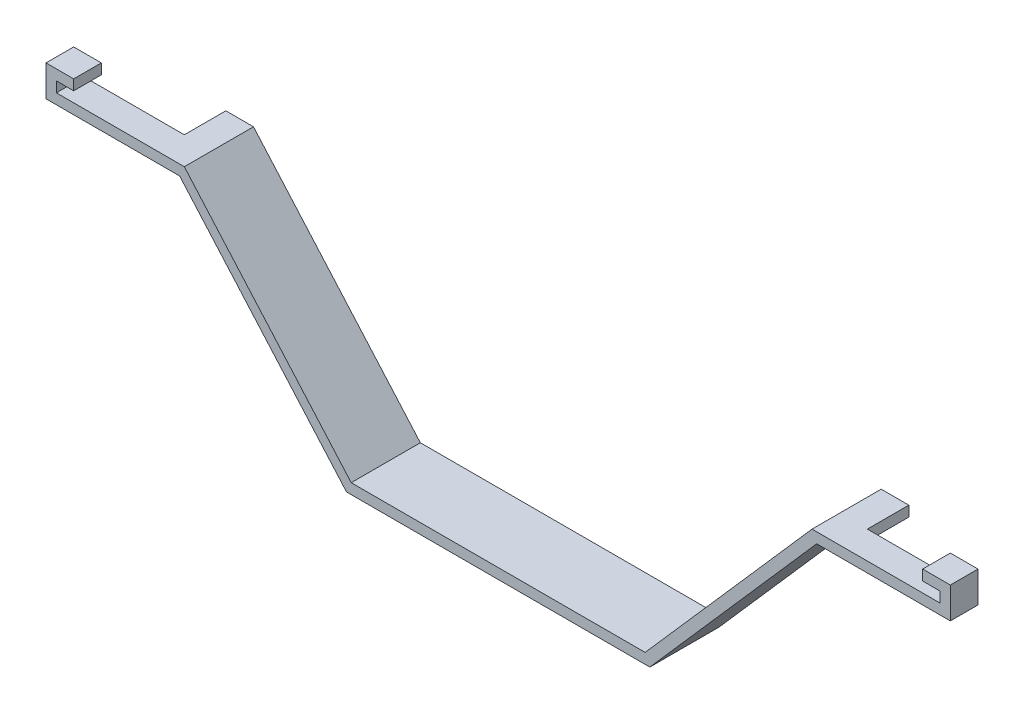
ISO-10303-21;
HEADER;
FILE_DESCRIPTION(('STEP AP214'),'2;1');
FILE_NAME('part.step','',(''),(''),'','','');
FILE_SCHEMA(('AUTOMOTIVE_DESIGN { 1 0 10303 214 1 1 1 1 }'));
ENDSEC;
DATA;
#1=APPLICATION_CONTEXT('core data for automotive mechanical design processes');
#2=APPLICATION_PROTOCOL_DEFINITION('international standard','automotive_design',2000,#1);
#3=PRODUCT_CONTEXT('',#1,'mechanical');
#4=PRODUCT('Part','Part','',(#3));
#5=PRODUCT_RELATED_PRODUCT_CATEGORY('part','',(#4));
#6=PRODUCT_DEFINITION_FORMATION('','',#4);
#7=PRODUCT_DEFINITION_CONTEXT('part definition',#1,'design');
#8=PRODUCT_DEFINITION('design','',#6,#7);
#9=PRODUCT_DEFINITION_SHAPE('','',#8);
#10=(LENGTH_UNIT() NAMED_UNIT(*) SI_UNIT(.MILLI.,.METRE.));
#11=(NAMED_UNIT(*) PLANE_ANGLE_UNIT() SI_UNIT($,.RADIAN.));
#12=(NAMED_UNIT(*) SI_UNIT($,.STERADIAN.) SOLID_ANGLE_UNIT());
#13=UNCERTAINTY_MEASURE_WITH_UNIT(LENGTH_MEASURE(1.E-05),#10,'distance_accuracy_value','');
#14=(GEOMETRIC_REPRESENTATION_CONTEXT(3) GLOBAL_UNCERTAINTY_ASSIGNED_CONTEXT((#13)) GLOBAL_UNIT_ASSIGNED_CONTEXT((#10,
#11,#12)) REPRESENTATION_CONTEXT('',''));
#15=CARTESIAN_POINT('',(0.,0.,0.));
#16=DIRECTION('',(0.,0.,1.));
#17=DIRECTION('',(1.,0.,0.));
#18=AXIS2_PLACEMENT_3D('',#15,#16,#17);
#19=CARTESIAN_POINT('',(-136.925616004308,29.5889707372712,20.));
#20=DIRECTION('',(-0.751729394315314,-0.65947169592207,0.));
#21=DIRECTION('',(0.65947169592207,-0.751729394315314,0.));
#22=AXIS2_PLACEMENT_3D('',#19,#20,#21);
#23=PLANE('',#22);
#24=DIRECTION('',(-0.65947169592207,0.751729394315314,0.));
#25=VECTOR('',#24,1.);
#26=CARTESIAN_POINT('',(-136.925616004308,29.5889707372712,0.));
#27=LINE('',#26,#25);
#28=CARTESIAN_POINT('',(-88.6756160043085,-25.4110292627288,0.));
#29=VERTEX_POINT('',#28);
#30=CARTESIAN_POINT('',(-136.925616004308,29.5889707372712,0.));
#31=VERTEX_POINT('',#30);
#32=EDGE_CURVE('E288',#29,#31,#27,.T.);
#33=ORIENTED_EDGE('',*,*,#32,.T.);
#34=DIRECTION('',(0.,0.,-1.));
#35=VECTOR('',#34,1.);
#36=CARTESIAN_POINT('',(-136.925616004308,29.5889707372712,20.));
#37=LINE('',#36,#35);
#38=CARTESIAN_POINT('',(-136.925616004308,29.5889707372712,20.));
#39=VERTEX_POINT('',#38);
#40=EDGE_CURVE('E235',#39,#31,#37,.T.);
#41=ORIENTED_EDGE('',*,*,#40,.F.);
#42=DIRECTION('',(-0.65947169592207,0.751729394315314,0.));
#43=VECTOR('',#42,1.);
#44=CARTESIAN_POINT('',(-136.925616004308,29.5889707372712,20.));
#45=LINE('',#44,#43);
#46=CARTESIAN_POINT('',(-88.6756160043085,-25.4110292627288,20.));
#47=VERTEX_POINT('',#46);
#48=EDGE_CURVE('E289',#47,#39,#45,.T.);
#49=ORIENTED_EDGE('',*,*,#48,.F.);
#50=DIRECTION('',(0.,0.,-1.));
#51=VECTOR('',#50,1.);
#52=CARTESIAN_POINT('',(-88.6756160043085,-25.4110292627288,20.));
#53=LINE('',#52,#51);
#54=EDGE_CURVE('E330',#47,#29,#53,.T.);
#55=ORIENTED_EDGE('',*,*,#54,.T.);
#56=EDGE_LOOP('',(#33,#41,#49,#55));
#57=FACE_BOUND('',#56,.T.);
#58=ADVANCED_FACE('F33',(#57),#23,.F.);
#59=CARTESIAN_POINT('',(-173.925616004308,29.5889707372712,20.));
#60=DIRECTION('',(0.,-1.,0.));
#61=DIRECTION('',(0.,0.,-1.));
#62=AXIS2_PLACEMENT_3D('',#59,#60,#61);
#63=PLANE('',#62);
#64=DIRECTION('',(-1.,0.,0.));
#65=VECTOR('',#64,1.);
#66=CARTESIAN_POINT('',(-173.925616004308,29.5889707372712,0.));
#67=LINE('',#66,#65);
#68=CARTESIAN_POINT('',(-144.925616004308,29.5889707372712,0.));
#69=VERTEX_POINT('',#68);
#70=EDGE_CURVE('E333',#31,#69,#67,.T.);
#71=ORIENTED_EDGE('',*,*,#70,.T.);
#72=DIRECTION('',(0.,0.,1.));
#73=VECTOR('',#72,1.);
#74=CARTESIAN_POINT('',(-144.925616004308,29.5889707372712,20.));
#75=LINE('',#74,#73);
#76=CARTESIAN_POINT('',(-144.925616004308,29.5889707372712,12.));
#77=VERTEX_POINT('',#76);
#78=EDGE_CURVE('E47',#69,#77,#75,.T.);
#79=ORIENTED_EDGE('',*,*,#78,.T.);
#80=DIRECTION('',(-1.,0.,0.));
#81=VECTOR('',#80,1.);
#82=CARTESIAN_POINT('',(-173.925616004308,29.5889707372712,12.));
#83=LINE('',#82,#81);
#84=CARTESIAN_POINT('',(-173.925616004308,29.5889707372712,12.));
#85=VERTEX_POINT('',#84);
#86=EDGE_CURVE('E285',#77,#85,#83,.T.);
#87=ORIENTED_EDGE('',*,*,#86,.T.);
#88=DIRECTION('',(0.,0.,-1.));
#89=VECTOR('',#88,1.);
#90=CARTESIAN_POINT('',(-173.925616004308,29.5889707372712,20.));
#91=LINE('',#90,#89);
#92=CARTESIAN_POINT('',(-173.925616004308,29.5889707372712,20.));
#93=VERTEX_POINT('',#92);
#94=EDGE_CURVE('E232',#93,#85,#91,.T.);
#95=ORIENTED_EDGE('',*,*,#94,.F.);
#96=DIRECTION('',(-1.,0.,0.));
#97=VECTOR('',#96,1.);
#98=CARTESIAN_POINT('',(-173.925616004308,29.5889707372712,20.));
#99=LINE('',#98,#97);
#100=EDGE_CURVE('E292',#39,#93,#99,.T.);
#101=ORIENTED_EDGE('',*,*,#100,.F.);
#102=ORIENTED_EDGE('',*,*,#40,.T.);
#103=EDGE_LOOP('',(#71,#79,#87,#95,#101,#102));
#104=FACE_BOUND('',#103,.T.);
#105=ADVANCED_FACE('F421',(#104),#63,.F.);
#106=CARTESIAN_POINT('',(-173.925616004308,32.5889707372712,20.));
#107=DIRECTION('',(-1.,0.,0.));
#108=DIRECTION('',(0.,0.,1.));
#109=AXIS2_PLACEMENT_3D('',#106,#107,#108);
#110=PLANE('',#109);
#111=ORIENTED_EDGE('',*,*,#94,.T.);
#112=DIRECTION('',(0.,1.,0.));
#113=VECTOR('',#112,1.);
#114=CARTESIAN_POINT('',(-173.925616004308,32.5889707372712,12.));
#115=LINE('',#114,#113);
#116=CARTESIAN_POINT('',(-173.925616004308,32.5889707372712,12.));
#117=VERTEX_POINT('',#116);
#118=EDGE_CURVE('E282',#85,#117,#115,.T.);
#119=ORIENTED_EDGE('',*,*,#118,.T.);
#120=DIRECTION('',(0.,0.,-1.));
#121=VECTOR('',#120,1.);
#122=CARTESIAN_POINT('',(-173.925616004308,32.5889707372712,20.));
#123=LINE('',#122,#121);
#124=CARTESIAN_POINT('',(-173.925616004308,32.5889707372712,20.));
#125=VERTEX_POINT('',#124);
#126=EDGE_CURVE('E229',#125,#117,#123,.T.);
#127=ORIENTED_EDGE('',*,*,#126,.F.);
#128=DIRECTION('',(0.,1.,0.));
#129=VECTOR('',#128,1.);
#130=CARTESIAN_POINT('',(-173.925616004308,32.5889707372712,20.));
#131=LINE('',#130,#129);
#132=EDGE_CURVE('E295',#93,#125,#131,.T.);
#133=ORIENTED_EDGE('',*,*,#132,.F.);
#134=EDGE_LOOP('',(#111,#119,#127,#133));
#135=FACE_BOUND('',#134,.T.);
#136=ADVANCED_FACE('F470',(#135),#110,.F.);
#137=CARTESIAN_POINT('',(-168.925616004308,32.5889707372712,20.));
#138=DIRECTION('',(0.,1.,0.));
#139=DIRECTION('',(0.,0.,1.));
#140=AXIS2_PLACEMENT_3D('',#137,#138,#139);
#141=PLANE('',#140);
#142=ORIENTED_EDGE('',*,*,#126,.T.);
#143=DIRECTION('',(1.,0.,0.));
#144=VECTOR('',#143,1.);
#145=CARTESIAN_POINT('',(-168.925616004308,32.5889707372712,12.));
#146=LINE('',#145,#144);
#147=CARTESIAN_POINT('',(-168.925616004308,32.5889707372712,12.));
#148=VERTEX_POINT('',#147);
#149=EDGE_CURVE('E279',#117,#148,#146,.T.);
#150=ORIENTED_EDGE('',*,*,#149,.T.);
#151=DIRECTION('',(0.,0.,-1.));
#152=VECTOR('',#151,1.);
#153=CARTESIAN_POINT('',(-168.925616004308,32.5889707372712,20.));
#154=LINE('',#153,#152);
#155=CARTESIAN_POINT('',(-168.925616004308,32.5889707372712,20.));
#156=VERTEX_POINT('',#155);
#157=EDGE_CURVE('E221',#156,#148,#154,.T.);
#158=ORIENTED_EDGE('',*,*,#157,.F.);
#159=DIRECTION('',(1.,0.,0.));
#160=VECTOR('',#159,1.);
#161=CARTESIAN_POINT('',(-168.925616004308,32.5889707372712,20.));
#162=LINE('',#161,#160);
#163=EDGE_CURVE('E297',#125,#156,#162,.T.);
#164=ORIENTED_EDGE('',*,*,#163,.F.);
#165=EDGE_LOOP('',(#142,#150,#158,#164));
#166=FACE_BOUND('',#165,.T.);
#167=ADVANCED_FACE('F474',(#166),#141,.F.);
#168=CARTESIAN_POINT('',(-168.925616004308,35.5889707372712,20.));
#169=DIRECTION('',(-1.,0.,0.));
#170=DIRECTION('',(0.,0.,1.));
#171=AXIS2_PLACEMENT_3D('',#168,#169,#170);
#172=PLANE('',#171);
#173=ORIENTED_EDGE('',*,*,#157,.T.);
#174=DIRECTION('',(0.,1.,0.));
#175=VECTOR('',#174,1.);
#176=CARTESIAN_POINT('',(-168.925616004308,35.5889707372712,12.));
#177=LINE('',#176,#175);
#178=CARTESIAN_POINT('',(-168.925616004308,35.5889707372712,12.));
#179=VERTEX_POINT('',#178);
#180=EDGE_CURVE('E277',#148,#179,#177,.T.);
#181=ORIENTED_EDGE('',*,*,#180,.T.);
#182=DIRECTION('',(0.,0.,-1.));
#183=VECTOR('',#182,1.);
#184=CARTESIAN_POINT('',(-168.925616004308,35.5889707372712,20.));
#185=LINE('',#184,#183);
#186=CARTESIAN_POINT('',(-168.925616004308,35.5889707372712,20.));
#187=VERTEX_POINT('',#186);
#188=EDGE_CURVE('E214',#187,#179,#185,.T.);
#189=ORIENTED_EDGE('',*,*,#188,.F.);
#190=DIRECTION('',(0.,1.,0.));
#191=VECTOR('',#190,1.);
#192=CARTESIAN_POINT('',(-168.925616004308,35.5889707372712,20.));
#193=LINE('',#192,#191);
#194=EDGE_CURVE('E299',#156,#187,#193,.T.);
#195=ORIENTED_EDGE('',*,*,#194,.F.);
#196=EDGE_LOOP('',(#173,#181,#189,#195));
#197=FACE_BOUND('',#196,.T.);
#198=ADVANCED_FACE('F480',(#197),#172,.F.);
#199=CARTESIAN_POINT('',(-176.925616004308,35.5889707372712,20.));
#200=DIRECTION('',(0.,-1.,0.));
#201=DIRECTION('',(0.,0.,-1.));
#202=AXIS2_PLACEMENT_3D('',#199,#200,#201);
#203=PLANE('',#202);
#204=ORIENTED_EDGE('',*,*,#188,.T.);
#205=DIRECTION('',(1.,0.,0.));
#206=VECTOR('',#205,1.);
#207=CARTESIAN_POINT('',(-176.925616004308,35.5889707372712,12.));
#208=LINE('',#207,#206);
#209=CARTESIAN_POINT('',(-176.925616004308,35.5889707372712,12.));
#210=VERTEX_POINT('',#209);
#211=EDGE_CURVE('E198',#210,#179,#208,.T.);
#212=ORIENTED_EDGE('',*,*,#211,.F.);
#213=DIRECTION('',(0.,0.,-1.));
#214=VECTOR('',#213,1.);
#215=CARTESIAN_POINT('',(-176.925616004308,35.5889707372712,20.));
#216=LINE('',#215,#214);
#217=CARTESIAN_POINT('',(-176.925616004308,35.5889707372712,20.));
#218=VERTEX_POINT('',#217);
#219=EDGE_CURVE('E211',#218,#210,#216,.T.);
#220=ORIENTED_EDGE('',*,*,#219,.F.);
#221=DIRECTION('',(-1.,0.,0.));
#222=VECTOR('',#221,1.);
#223=CARTESIAN_POINT('',(-176.925616004308,35.5889707372712,20.));
#224=LINE('',#223,#222);
#225=EDGE_CURVE('E301',#187,#218,#224,.T.);
#226=ORIENTED_EDGE('',*,*,#225,.F.);
#227=EDGE_LOOP('',(#204,#212,#220,#226));
#228=FACE_BOUND('',#227,.T.);
#229=ADVANCED_FACE('F209',(#228),#203,.F.);
#230=CARTESIAN_POINT('',(-176.925616004308,26.5889707372712,20.));
#231=DIRECTION('',(1.,0.,0.));
#232=DIRECTION('',(0.,0.,-1.));
#233=AXIS2_PLACEMENT_3D('',#230,#231,#232);
#234=PLANE('',#233);
#235=ORIENTED_EDGE('',*,*,#219,.T.);
#236=DIRECTION('',(0.,1.,0.));
#237=VECTOR('',#236,1.);
#238=CARTESIAN_POINT('',(-176.925616004308,-28.4110292627288,12.));
#239=LINE('',#238,#237);
#240=CARTESIAN_POINT('',(-176.925616004308,26.5889707372712,12.));
#241=VERTEX_POINT('',#240);
#242=EDGE_CURVE('E194',#241,#210,#239,.T.);
#243=ORIENTED_EDGE('',*,*,#242,.F.);
#244=DIRECTION('',(0.,0.,-1.));
#245=VECTOR('',#244,1.);
#246=CARTESIAN_POINT('',(-176.925616004308,26.5889707372712,20.));
#247=LINE('',#246,#245);
#248=CARTESIAN_POINT('',(-176.925616004308,26.5889707372712,20.));
#249=VERTEX_POINT('',#248);
#250=EDGE_CURVE('E219',#249,#241,#247,.T.);
#251=ORIENTED_EDGE('',*,*,#250,.F.);
#252=DIRECTION('',(0.,-1.,0.));
#253=VECTOR('',#252,1.);
#254=CARTESIAN_POINT('',(-176.925616004308,26.5889707372712,20.));
#255=LINE('',#254,#253);
#256=EDGE_CURVE('E218',#218,#249,#255,.T.);
#257=ORIENTED_EDGE('',*,*,#256,.F.);
#258=EDGE_LOOP('',(#235,#243,#251,#257));
#259=FACE_BOUND('',#258,.T.);
#260=ADVANCED_FACE('F217',(#259),#234,.F.);
#261=CARTESIAN_POINT('',(-176.925616004308,26.5889707372712,20.));
#262=DIRECTION('',(0.,1.,0.));
#263=DIRECTION('',(0.,0.,1.));
#264=AXIS2_PLACEMENT_3D('',#261,#262,#263);
#265=PLANE('',#264);
#266=DIRECTION('',(1.,0.,0.));
#267=VECTOR('',#266,1.);
#268=CARTESIAN_POINT('',(-176.925616004308,26.5889707372712,12.));
#269=LINE('',#268,#267);
#270=CARTESIAN_POINT('',(-144.925616004308,26.5889707372712,12.));
#271=VERTEX_POINT('',#270);
#272=EDGE_CURVE('E11',#241,#271,#269,.T.);
#273=ORIENTED_EDGE('',*,*,#272,.T.);
#274=DIRECTION('',(0.,0.,-1.));
#275=VECTOR('',#274,1.);
#276=CARTESIAN_POINT('',(-144.925616004308,26.5889707372712,20.));
#277=LINE('',#276,#275);
#278=CARTESIAN_POINT('',(-144.925616004308,26.5889707372712,0.));
#279=VERTEX_POINT('',#278);
#280=EDGE_CURVE('E268',#271,#279,#277,.T.);
#281=ORIENTED_EDGE('',*,*,#280,.T.);
#282=DIRECTION('',(1.,0.,0.));
#283=VECTOR('',#282,1.);
#284=CARTESIAN_POINT('',(-176.925616004308,26.5889707372712,0.));
#285=LINE('',#284,#283);
#286=CARTESIAN_POINT('',(-138.284595605158,26.5889707372712,0.));
#287=VERTEX_POINT('',#286);
#288=EDGE_CURVE('E336',#279,#287,#285,.T.);
#289=ORIENTED_EDGE('',*,*,#288,.T.);
#290=DIRECTION('',(0.,0.,-1.));
#291=VECTOR('',#290,1.);
#292=CARTESIAN_POINT('',(-138.284595605158,26.5889707372712,20.));
#293=LINE('',#292,#291);
#294=CARTESIAN_POINT('',(-138.284595605158,26.5889707372712,20.));
#295=VERTEX_POINT('',#294);
#296=EDGE_CURVE('E223',#295,#287,#293,.T.);
#297=ORIENTED_EDGE('',*,*,#296,.F.);
#298=DIRECTION('',(1.,0.,0.));
#299=VECTOR('',#298,1.);
#300=CARTESIAN_POINT('',(-176.925616004308,26.5889707372712,20.));
#301=LINE('',#300,#299);
#302=EDGE_CURVE('E304',#249,#295,#301,.T.);
#303=ORIENTED_EDGE('',*,*,#302,.F.);
#304=ORIENTED_EDGE('',*,*,#250,.T.);
#305=EDGE_LOOP('',(#273,#281,#289,#297,#303,#304));
#306=FACE_BOUND('',#305,.T.);
#307=ADVANCED_FACE('F409',(#306),#265,.F.);
#308=CARTESIAN_POINT('',(-138.284595605158,26.5889707372712,20.));
#309=DIRECTION('',(0.751729394315314,0.65947169592207,0.));
#310=DIRECTION('',(-0.65947169592207,0.751729394315314,0.));
#311=AXIS2_PLACEMENT_3D('',#308,#309,#310);
#312=PLANE('',#311);
#313=DIRECTION('',(0.65947169592207,-0.751729394315314,0.));
#314=VECTOR('',#313,1.);
#315=CARTESIAN_POINT('',(-138.284595605158,26.5889707372712,0.));
#316=LINE('',#315,#314);
#317=CARTESIAN_POINT('',(-90.0345956051584,-28.4110292627288,0.));
#318=VERTEX_POINT('',#317);
#319=EDGE_CURVE('E338',#287,#318,#316,.T.);
#320=ORIENTED_EDGE('',*,*,#319,.T.);
#321=DIRECTION('',(0.,0.,-1.));
#322=VECTOR('',#321,1.);
#323=CARTESIAN_POINT('',(-90.0345956051584,-28.4110292627288,20.));
#324=LINE('',#323,#322);
#325=CARTESIAN_POINT('',(-90.0345956051584,-28.4110292627288,20.));
#326=VERTEX_POINT('',#325);
#327=EDGE_CURVE('E380',#326,#318,#324,.T.);
#328=ORIENTED_EDGE('',*,*,#327,.F.);
#329=DIRECTION('',(0.65947169592207,-0.751729394315314,0.));
#330=VECTOR('',#329,1.);
#331=CARTESIAN_POINT('',(-138.284595605158,26.5889707372712,20.));
#332=LINE('',#331,#330);
#333=EDGE_CURVE('E306',#295,#326,#332,.T.);
#334=ORIENTED_EDGE('',*,*,#333,.F.);
#335=ORIENTED_EDGE('',*,*,#296,.T.);
#336=EDGE_LOOP('',(#320,#328,#334,#335));
#337=FACE_BOUND('',#336,.T.);
#338=ADVANCED_FACE('F387',(#337),#312,.F.);
#339=CARTESIAN_POINT('',(-90.0345956051584,-28.4110292627288,20.));
#340=DIRECTION('',(0.,1.,0.));
#341=DIRECTION('',(0.,0.,1.));
#342=AXIS2_PLACEMENT_3D('',#339,#340,#341);
#343=PLANE('',#342);
#344=DIRECTION('',(1.,0.,0.));
#345=VECTOR('',#344,1.);
#346=CARTESIAN_POINT('',(-90.0345956051584,-28.4110292627288,0.));
#347=LINE('',#346,#345);
#348=CARTESIAN_POINT('',(-2.31663640345854,-28.4110292627288,0.));
#349=VERTEX_POINT('',#348);
#350=EDGE_CURVE('E340',#318,#349,#347,.T.);
#351=ORIENTED_EDGE('',*,*,#350,.T.);
#352=DIRECTION('',(0.,0.,-1.));
#353=VECTOR('',#352,1.);
#354=CARTESIAN_POINT('',(-2.31663640345854,-28.4110292627288,20.));
#355=LINE('',#354,#353);
#356=CARTESIAN_POINT('',(-2.31663640345854,-28.4110292627288,20.));
#357=VERTEX_POINT('',#356);
#358=EDGE_CURVE('E377',#357,#349,#355,.T.);
#359=ORIENTED_EDGE('',*,*,#358,.F.);
#360=DIRECTION('',(1.,0.,0.));
#361=VECTOR('',#360,1.);
#362=CARTESIAN_POINT('',(-90.0345956051584,-28.4110292627288,20.));
#363=LINE('',#362,#361);
#364=EDGE_CURVE('E308',#326,#357,#363,.T.);
#365=ORIENTED_EDGE('',*,*,#364,.F.);
#366=ORIENTED_EDGE('',*,*,#327,.T.);
#367=EDGE_LOOP('',(#351,#359,#365,#366));
#368=FACE_BOUND('',#367,.T.);
#369=ADVANCED_FACE('F399',(#368),#343,.F.);
#370=CARTESIAN_POINT('',(45.9333635965414,26.5889707372712,20.));
#371=DIRECTION('',(-0.751729394315314,0.65947169592207,0.));
#372=DIRECTION('',(-0.65947169592207,-0.751729394315314,0.));
#373=AXIS2_PLACEMENT_3D('',#370,#371,#372);
#374=PLANE('',#373);
#375=DIRECTION('',(0.65947169592207,0.751729394315314,0.));
#376=VECTOR('',#375,1.);
#377=CARTESIAN_POINT('',(45.9333635965414,26.5889707372712,0.));
#378=LINE('',#377,#376);
#379=CARTESIAN_POINT('',(45.9333635965414,26.5889707372712,0.));
#380=VERTEX_POINT('',#379);
#381=EDGE_CURVE('E342',#349,#380,#378,.T.);
#382=ORIENTED_EDGE('',*,*,#381,.T.);
#383=DIRECTION('',(0.,0.,-1.));
#384=VECTOR('',#383,1.);
#385=CARTESIAN_POINT('',(45.9333635965414,26.5889707372712,20.));
#386=LINE('',#385,#384);
#387=CARTESIAN_POINT('',(45.9333635965414,26.5889707372712,20.));
#388=VERTEX_POINT('',#387);
#389=EDGE_CURVE('E374',#388,#380,#386,.T.);
#390=ORIENTED_EDGE('',*,*,#389,.F.);
#391=DIRECTION('',(0.65947169592207,0.751729394315314,0.));
#392=VECTOR('',#391,1.);
#393=CARTESIAN_POINT('',(45.9333635965414,26.5889707372712,20.));
#394=LINE('',#393,#392);
#395=EDGE_CURVE('E310',#357,#388,#394,.T.);
#396=ORIENTED_EDGE('',*,*,#395,.F.);
#397=ORIENTED_EDGE('',*,*,#358,.T.);
#398=EDGE_LOOP('',(#382,#390,#396,#397));
#399=FACE_BOUND('',#398,.T.);
#400=ADVANCED_FACE('F403',(#399),#374,.F.);
#401=CARTESIAN_POINT('',(84.5743839956915,26.5889707372712,20.));
#402=DIRECTION('',(0.,1.,0.));
#403=DIRECTION('',(-1.,0.,0.));
#404=AXIS2_PLACEMENT_3D('',#401,#402,#403);
#405=PLANE('',#404);
#406=DIRECTION('',(0.,0.,1.));
#407=VECTOR('',#406,1.);
#408=CARTESIAN_POINT('',(52.5743839956915,26.5889707372712,20.));
#409=LINE('',#408,#407);
#410=CARTESIAN_POINT('',(52.5743839956915,26.5889707372712,0.));
#411=VERTEX_POINT('',#410);
#412=CARTESIAN_POINT('',(52.5743839956915,26.5889707372712,12.));
#413=VERTEX_POINT('',#412);
#414=EDGE_CURVE('E55',#411,#413,#409,.T.);
#415=ORIENTED_EDGE('',*,*,#414,.T.);
#416=DIRECTION('',(1.,0.,0.));
#417=VECTOR('',#416,1.);
#418=CARTESIAN_POINT('',(84.5743839956915,26.5889707372712,12.));
#419=LINE('',#418,#417);
#420=CARTESIAN_POINT('',(84.5743839956915,26.5889707372712,12.));
#421=VERTEX_POINT('',#420);
#422=EDGE_CURVE('E274',#413,#421,#419,.T.);
#423=ORIENTED_EDGE('',*,*,#422,.T.);
#424=DIRECTION('',(0.,0.,-1.));
#425=VECTOR('',#424,1.);
#426=CARTESIAN_POINT('',(84.5743839956915,26.5889707372712,20.));
#427=LINE('',#426,#425);
#428=CARTESIAN_POINT('',(84.5743839956915,26.5889707372712,20.));
#429=VERTEX_POINT('',#428);
#430=EDGE_CURVE('E371',#429,#421,#427,.T.);
#431=ORIENTED_EDGE('',*,*,#430,.F.);
#432=DIRECTION('',(1.,0.,0.));
#433=VECTOR('',#432,1.);
#434=CARTESIAN_POINT('',(84.5743839956915,26.5889707372712,20.));
#435=LINE('',#434,#433);
#436=EDGE_CURVE('E312',#388,#429,#435,.T.);
#437=ORIENTED_EDGE('',*,*,#436,.F.);
#438=ORIENTED_EDGE('',*,*,#389,.T.);
#439=DIRECTION('',(1.,0.,0.));
#440=VECTOR('',#439,1.);
#441=CARTESIAN_POINT('',(84.5743839956915,26.5889707372712,0.));
#442=LINE('',#441,#440);
#443=EDGE_CURVE('E344',#380,#411,#442,.T.);
#444=ORIENTED_EDGE('',*,*,#443,.T.);
#445=EDGE_LOOP('',(#415,#423,#431,#437,#438,#444));
#446=FACE_BOUND('',#445,.T.);
#447=ADVANCED_FACE('F455',(#446),#405,.F.);
#448=CARTESIAN_POINT('',(84.5743839956915,26.5889707372712,20.));
#449=DIRECTION('',(-1.,0.,0.));
#450=DIRECTION('',(0.,0.,1.));
#451=AXIS2_PLACEMENT_3D('',#448,#449,#450);
#452=PLANE('',#451);
#453=ORIENTED_EDGE('',*,*,#430,.T.);
#454=DIRECTION('',(0.,1.,0.));
#455=VECTOR('',#454,1.);
#456=CARTESIAN_POINT('',(84.5743839956915,-28.4110292627288,12.));
#457=LINE('',#456,#455);
#458=CARTESIAN_POINT('',(84.5743839956915,35.5889707372712,12.));
#459=VERTEX_POINT('',#458);
#460=EDGE_CURVE('E215',#421,#459,#457,.T.);
#461=ORIENTED_EDGE('',*,*,#460,.T.);
#462=DIRECTION('',(0.,0.,-1.));
#463=VECTOR('',#462,1.);
#464=CARTESIAN_POINT('',(84.5743839956915,35.5889707372712,20.));
#465=LINE('',#464,#463);
#466=CARTESIAN_POINT('',(84.5743839956915,35.5889707372712,20.));
#467=VERTEX_POINT('',#466);
#468=EDGE_CURVE('E368',#467,#459,#465,.T.);
#469=ORIENTED_EDGE('',*,*,#468,.F.);
#470=DIRECTION('',(0.,1.,0.));
#471=VECTOR('',#470,1.);
#472=CARTESIAN_POINT('',(84.5743839956915,26.5889707372712,20.));
#473=LINE('',#472,#471);
#474=EDGE_CURVE('E314',#429,#467,#473,.T.);
#475=ORIENTED_EDGE('',*,*,#474,.F.);
#476=EDGE_LOOP('',(#453,#461,#469,#475));
#477=FACE_BOUND('',#476,.T.);
#478=ADVANCED_FACE('F452',(#477),#452,.F.);
#479=CARTESIAN_POINT('',(84.5743839956915,35.5889707372712,20.));
#480=DIRECTION('',(0.,-1.,0.));
#481=DIRECTION('',(1.,0.,0.));
#482=AXIS2_PLACEMENT_3D('',#479,#480,#481);
#483=PLANE('',#482);
#484=ORIENTED_EDGE('',*,*,#468,.T.);
#485=DIRECTION('',(1.,0.,0.));
#486=VECTOR('',#485,1.);
#487=CARTESIAN_POINT('',(84.5743839956915,35.5889707372712,12.));
#488=LINE('',#487,#486);
#489=CARTESIAN_POINT('',(76.5743839956915,35.5889707372712,12.));
#490=VERTEX_POINT('',#489);
#491=EDGE_CURVE('E415',#490,#459,#488,.T.);
#492=ORIENTED_EDGE('',*,*,#491,.F.);
#493=DIRECTION('',(0.,0.,-1.));
#494=VECTOR('',#493,1.);
#495=CARTESIAN_POINT('',(76.5743839956915,35.5889707372712,20.));
#496=LINE('',#495,#494);
#497=CARTESIAN_POINT('',(76.5743839956915,35.5889707372712,20.));
#498=VERTEX_POINT('',#497);
#499=EDGE_CURVE('E365',#498,#490,#496,.T.);
#500=ORIENTED_EDGE('',*,*,#499,.F.);
#501=DIRECTION('',(-1.,0.,0.));
#502=VECTOR('',#501,1.);
#503=CARTESIAN_POINT('',(84.5743839956915,35.5889707372712,20.));
#504=LINE('',#503,#502);
#505=EDGE_CURVE('E316',#467,#498,#504,.T.);
#506=ORIENTED_EDGE('',*,*,#505,.F.);
#507=EDGE_LOOP('',(#484,#492,#500,#506));
#508=FACE_BOUND('',#507,.T.);
#509=ADVANCED_FACE('F449',(#508),#483,.F.);
#510=CARTESIAN_POINT('',(76.5743839956915,35.5889707372712,20.));
#511=DIRECTION('',(1.,0.,0.));
#512=DIRECTION('',(0.,0.,-1.));
#513=AXIS2_PLACEMENT_3D('',#510,#511,#512);
#514=PLANE('',#513);
#515=ORIENTED_EDGE('',*,*,#499,.T.);
#516=DIRECTION('',(0.,-1.,0.));
#517=VECTOR('',#516,1.);
#518=CARTESIAN_POINT('',(76.5743839956915,35.5889707372712,12.));
#519=LINE('',#518,#517);
#520=CARTESIAN_POINT('',(76.5743839956915,32.5889707372712,12.));
#521=VERTEX_POINT('',#520);
#522=EDGE_CURVE('E266',#490,#521,#519,.T.);
#523=ORIENTED_EDGE('',*,*,#522,.T.);
#524=DIRECTION('',(0.,0.,-1.));
#525=VECTOR('',#524,1.);
#526=CARTESIAN_POINT('',(76.5743839956915,32.5889707372712,20.));
#527=LINE('',#526,#525);
#528=CARTESIAN_POINT('',(76.5743839956915,32.5889707372712,20.));
#529=VERTEX_POINT('',#528);
#530=EDGE_CURVE('E362',#529,#521,#527,.T.);
#531=ORIENTED_EDGE('',*,*,#530,.F.);
#532=DIRECTION('',(0.,-1.,0.));
#533=VECTOR('',#532,1.);
#534=CARTESIAN_POINT('',(76.5743839956915,35.5889707372712,20.));
#535=LINE('',#534,#533);
#536=EDGE_CURVE('E318',#498,#529,#535,.T.);
#537=ORIENTED_EDGE('',*,*,#536,.F.);
#538=EDGE_LOOP('',(#515,#523,#531,#537));
#539=FACE_BOUND('',#538,.T.);
#540=ADVANCED_FACE('F445',(#539),#514,.F.);
#541=CARTESIAN_POINT('',(76.5743839956915,32.5889707372712,20.));
#542=DIRECTION('',(0.,1.,0.));
#543=DIRECTION('',(0.,0.,1.));
#544=AXIS2_PLACEMENT_3D('',#541,#542,#543);
#545=PLANE('',#544);
#546=ORIENTED_EDGE('',*,*,#530,.T.);
#547=DIRECTION('',(1.,0.,0.));
#548=VECTOR('',#547,1.);
#549=CARTESIAN_POINT('',(76.5743839956915,32.5889707372712,12.));
#550=LINE('',#549,#548);
#551=CARTESIAN_POINT('',(81.5743839956915,32.5889707372712,12.));
#552=VERTEX_POINT('',#551);
#553=EDGE_CURVE('E264',#521,#552,#550,.T.);
#554=ORIENTED_EDGE('',*,*,#553,.T.);
#555=DIRECTION('',(0.,0.,-1.));
#556=VECTOR('',#555,1.);
#557=CARTESIAN_POINT('',(81.5743839956915,32.5889707372712,20.));
#558=LINE('',#557,#556);
#559=CARTESIAN_POINT('',(81.5743839956915,32.5889707372712,20.));
#560=VERTEX_POINT('',#559);
#561=EDGE_CURVE('E263',#560,#552,#558,.T.);
#562=ORIENTED_EDGE('',*,*,#561,.F.);
#563=DIRECTION('',(1.,0.,0.));
#564=VECTOR('',#563,1.);
#565=CARTESIAN_POINT('',(76.5743839956915,32.5889707372712,20.));
#566=LINE('',#565,#564);
#567=EDGE_CURVE('E320',#529,#560,#566,.T.);
#568=ORIENTED_EDGE('',*,*,#567,.F.);
#569=EDGE_LOOP('',(#546,#554,#562,#568));
#570=FACE_BOUND('',#569,.T.);
#571=ADVANCED_FACE('F442',(#570),#545,.F.);
#572=CARTESIAN_POINT('',(81.5743839956915,32.5889707372712,20.));
#573=DIRECTION('',(1.,0.,0.));
#574=DIRECTION('',(0.,0.,-1.));
#575=AXIS2_PLACEMENT_3D('',#572,#573,#574);
#576=PLANE('',#575);
#577=ORIENTED_EDGE('',*,*,#561,.T.);
#578=DIRECTION('',(0.,-1.,0.));
#579=VECTOR('',#578,1.);
#580=CARTESIAN_POINT('',(81.5743839956915,32.5889707372712,12.));
#581=LINE('',#580,#579);
#582=CARTESIAN_POINT('',(81.5743839956915,29.5889707372712,12.));
#583=VERTEX_POINT('',#582);
#584=EDGE_CURVE('E255',#552,#583,#581,.T.);
#585=ORIENTED_EDGE('',*,*,#584,.T.);
#586=DIRECTION('',(0.,0.,-1.));
#587=VECTOR('',#586,1.);
#588=CARTESIAN_POINT('',(81.5743839956915,29.5889707372712,20.));
#589=LINE('',#588,#587);
#590=CARTESIAN_POINT('',(81.5743839956915,29.5889707372712,20.));
#591=VERTEX_POINT('',#590);
#592=EDGE_CURVE('E250',#591,#583,#589,.T.);
#593=ORIENTED_EDGE('',*,*,#592,.F.);
#594=DIRECTION('',(0.,-1.,0.));
#595=VECTOR('',#594,1.);
#596=CARTESIAN_POINT('',(81.5743839956915,32.5889707372712,20.));
#597=LINE('',#596,#595);
#598=EDGE_CURVE('E322',#560,#591,#597,.T.);
#599=ORIENTED_EDGE('',*,*,#598,.F.);
#600=EDGE_LOOP('',(#577,#585,#593,#599));
#601=FACE_BOUND('',#600,.T.);
#602=ADVANCED_FACE('F260',(#601),#576,.F.);
#603=CARTESIAN_POINT('',(81.5743839956915,29.5889707372712,20.));
#604=DIRECTION('',(0.,-1.,0.));
#605=DIRECTION('',(1.,0.,0.));
#606=AXIS2_PLACEMENT_3D('',#603,#604,#605);
#607=PLANE('',#606);
#608=ORIENTED_EDGE('',*,*,#592,.T.);
#609=DIRECTION('',(-1.,0.,0.));
#610=VECTOR('',#609,1.);
#611=CARTESIAN_POINT('',(81.5743839956915,29.5889707372712,12.));
#612=LINE('',#611,#610);
#613=CARTESIAN_POINT('',(52.5743839956915,29.5889707372712,12.));
#614=VERTEX_POINT('',#613);
#615=EDGE_CURVE('E40',#583,#614,#612,.T.);
#616=ORIENTED_EDGE('',*,*,#615,.T.);
#617=DIRECTION('',(0.,0.,-1.));
#618=VECTOR('',#617,1.);
#619=CARTESIAN_POINT('',(52.5743839956915,29.5889707372712,20.));
#620=LINE('',#619,#618);
#621=CARTESIAN_POINT('',(52.5743839956915,29.5889707372712,0.));
#622=VERTEX_POINT('',#621);
#623=EDGE_CURVE('E246',#614,#622,#620,.T.);
#624=ORIENTED_EDGE('',*,*,#623,.T.);
#625=DIRECTION('',(-1.,0.,0.));
#626=VECTOR('',#625,1.);
#627=CARTESIAN_POINT('',(81.5743839956915,29.5889707372712,0.));
#628=LINE('',#627,#626);
#629=CARTESIAN_POINT('',(44.5743839956915,29.5889707372712,0.));
#630=VERTEX_POINT('',#629);
#631=EDGE_CURVE('E347',#622,#630,#628,.T.);
#632=ORIENTED_EDGE('',*,*,#631,.T.);
#633=DIRECTION('',(0.,0.,-1.));
#634=VECTOR('',#633,1.);
#635=CARTESIAN_POINT('',(44.5743839956915,29.5889707372712,20.));
#636=LINE('',#635,#634);
#637=CARTESIAN_POINT('',(44.5743839956915,29.5889707372712,20.));
#638=VERTEX_POINT('',#637);
#639=EDGE_CURVE('E357',#638,#630,#636,.T.);
#640=ORIENTED_EDGE('',*,*,#639,.F.);
#641=DIRECTION('',(-1.,0.,0.));
#642=VECTOR('',#641,1.);
#643=CARTESIAN_POINT('',(81.5743839956915,29.5889707372712,20.));
#644=LINE('',#643,#642);
#645=EDGE_CURVE('E324',#591,#638,#644,.T.);
#646=ORIENTED_EDGE('',*,*,#645,.F.);
#647=EDGE_LOOP('',(#608,#616,#624,#632,#640,#646));
#648=FACE_BOUND('',#647,.T.);
#649=ADVANCED_FACE('F245',(#648),#607,.F.);
#650=CARTESIAN_POINT('',(44.5743839956915,29.5889707372712,20.));
#651=DIRECTION('',(0.751729394315314,-0.65947169592207,0.));
#652=DIRECTION('',(0.65947169592207,0.751729394315314,0.));
#653=AXIS2_PLACEMENT_3D('',#650,#651,#652);
#654=PLANE('',#653);
#655=DIRECTION('',(-0.65947169592207,-0.751729394315314,0.));
#656=VECTOR('',#655,1.);
#657=CARTESIAN_POINT('',(44.5743839956915,29.5889707372712,0.));
#658=LINE('',#657,#656);
#659=CARTESIAN_POINT('',(-3.67561600430848,-25.4110292627288,0.));
#660=VERTEX_POINT('',#659);
#661=EDGE_CURVE('E349',#630,#660,#658,.T.);
#662=ORIENTED_EDGE('',*,*,#661,.T.);
#663=DIRECTION('',(0.,0.,-1.));
#664=VECTOR('',#663,1.);
#665=CARTESIAN_POINT('',(-3.67561600430848,-25.4110292627288,20.));
#666=LINE('',#665,#664);
#667=CARTESIAN_POINT('',(-3.67561600430848,-25.4110292627288,20.));
#668=VERTEX_POINT('',#667);
#669=EDGE_CURVE('E354',#668,#660,#666,.T.);
#670=ORIENTED_EDGE('',*,*,#669,.F.);
#671=DIRECTION('',(-0.65947169592207,-0.751729394315314,0.));
#672=VECTOR('',#671,1.);
#673=CARTESIAN_POINT('',(44.5743839956915,29.5889707372712,20.));
#674=LINE('',#673,#672);
#675=EDGE_CURVE('E326',#638,#668,#674,.T.);
#676=ORIENTED_EDGE('',*,*,#675,.F.);
#677=ORIENTED_EDGE('',*,*,#639,.T.);
#678=EDGE_LOOP('',(#662,#670,#676,#677));
#679=FACE_BOUND('',#678,.T.);
#680=ADVANCED_FACE('F436',(#679),#654,.F.);
#681=CARTESIAN_POINT('',(-88.6756160043085,-25.4110292627288,20.));
#682=DIRECTION('',(0.,-1.,0.));
#683=DIRECTION('',(0.,0.,-1.));
#684=AXIS2_PLACEMENT_3D('',#681,#682,#683);
#685=PLANE('',#684);
#686=DIRECTION('',(-1.,0.,0.));
#687=VECTOR('',#686,1.);
#688=CARTESIAN_POINT('',(-88.6756160043085,-25.4110292627288,0.));
#689=LINE('',#688,#687);
#690=EDGE_CURVE('E293',#660,#29,#689,.T.);
#691=ORIENTED_EDGE('',*,*,#690,.T.);
#692=ORIENTED_EDGE('',*,*,#54,.F.);
#693=DIRECTION('',(-1.,0.,0.));
#694=VECTOR('',#693,1.);
#695=CARTESIAN_POINT('',(-88.6756160043085,-25.4110292627288,20.));
#696=LINE('',#695,#694);
#697=EDGE_CURVE('E328',#668,#47,#696,.T.);
#698=ORIENTED_EDGE('',*,*,#697,.F.);
#699=ORIENTED_EDGE('',*,*,#669,.T.);
#700=EDGE_LOOP('',(#691,#692,#698,#699));
#701=FACE_BOUND('',#700,.T.);
#702=ADVANCED_FACE('F432',(#701),#685,.F.);
#703=CARTESIAN_POINT('',(0.,0.,20.));
#704=DIRECTION('',(0.,0.,-1.));
#705=DIRECTION('',(-1.,0.,0.));
#706=AXIS2_PLACEMENT_3D('',#703,#704,#705);
#707=PLANE('',#706);
#708=ORIENTED_EDGE('',*,*,#48,.T.);
#709=ORIENTED_EDGE('',*,*,#100,.T.);
#710=ORIENTED_EDGE('',*,*,#132,.T.);
#711=ORIENTED_EDGE('',*,*,#163,.T.);
#712=ORIENTED_EDGE('',*,*,#194,.T.);
#713=ORIENTED_EDGE('',*,*,#225,.T.);
#714=ORIENTED_EDGE('',*,*,#256,.T.);
#715=ORIENTED_EDGE('',*,*,#302,.T.);
#716=ORIENTED_EDGE('',*,*,#333,.T.);
#717=ORIENTED_EDGE('',*,*,#364,.T.);
#718=ORIENTED_EDGE('',*,*,#395,.T.);
#719=ORIENTED_EDGE('',*,*,#436,.T.);
#720=ORIENTED_EDGE('',*,*,#474,.T.);
#721=ORIENTED_EDGE('',*,*,#505,.T.);
#722=ORIENTED_EDGE('',*,*,#536,.T.);
#723=ORIENTED_EDGE('',*,*,#567,.T.);
#724=ORIENTED_EDGE('',*,*,#598,.T.);
#725=ORIENTED_EDGE('',*,*,#645,.T.);
#726=ORIENTED_EDGE('',*,*,#675,.T.);
#727=ORIENTED_EDGE('',*,*,#697,.T.);
#728=EDGE_LOOP('',(#708,#709,#710,#711,#712,#713,#714,#715,#716,#717,#718,#719,#720,#721,#722,
#723,#724,#725,#726,#727));
#729=FACE_BOUND('',#728,.T.);
#730=ADVANCED_FACE('F407',(#729),#707,.F.);
#731=CARTESIAN_POINT('',(0.,0.,0.));
#732=DIRECTION('',(0.,0.,-1.));
#733=DIRECTION('',(-1.,0.,0.));
#734=AXIS2_PLACEMENT_3D('',#731,#732,#733);
#735=PLANE('',#734);
#736=DIRECTION('',(0.,-1.,0.));
#737=VECTOR('',#736,1.);
#738=CARTESIAN_POINT('',(-144.925616004308,0.,0.));
#739=LINE('',#738,#737);
#740=EDGE_CURVE('E240',#69,#279,#739,.T.);
#741=ORIENTED_EDGE('',*,*,#740,.F.);
#742=ORIENTED_EDGE('',*,*,#70,.F.);
#743=ORIENTED_EDGE('',*,*,#32,.F.);
#744=ORIENTED_EDGE('',*,*,#690,.F.);
#745=ORIENTED_EDGE('',*,*,#661,.F.);
#746=ORIENTED_EDGE('',*,*,#631,.F.);
#747=DIRECTION('',(0.,1.,0.));
#748=VECTOR('',#747,1.);
#749=CARTESIAN_POINT('',(52.5743839956915,0.,0.));
#750=LINE('',#749,#748);
#751=EDGE_CURVE('E238',#411,#622,#750,.T.);
#752=ORIENTED_EDGE('',*,*,#751,.F.);
#753=ORIENTED_EDGE('',*,*,#443,.F.);
#754=ORIENTED_EDGE('',*,*,#381,.F.);
#755=ORIENTED_EDGE('',*,*,#350,.F.);
#756=ORIENTED_EDGE('',*,*,#319,.F.);
#757=ORIENTED_EDGE('',*,*,#288,.F.);
#758=EDGE_LOOP('',(#741,#742,#743,#744,#745,#746,#752,#753,#754,#755,#756,#757));
#759=FACE_BOUND('',#758,.T.);
#760=ADVANCED_FACE('F394',(#759),#735,.T.);
#761=CARTESIAN_POINT('',(84.5743839956915,-28.4110292627288,12.));
#762=DIRECTION('',(0.,0.,1.));
#763=DIRECTION('',(1.,0.,0.));
#764=AXIS2_PLACEMENT_3D('',#761,#762,#763);
#765=PLANE('',#764);
#766=DIRECTION('',(0.,1.,0.));
#767=VECTOR('',#766,1.);
#768=CARTESIAN_POINT('',(52.5743839956915,-28.4110292627288,12.));
#769=LINE('',#768,#767);
#770=EDGE_CURVE('E257',#413,#614,#769,.T.);
#771=ORIENTED_EDGE('',*,*,#770,.T.);
#772=ORIENTED_EDGE('',*,*,#615,.F.);
#773=ORIENTED_EDGE('',*,*,#584,.F.);
#774=ORIENTED_EDGE('',*,*,#553,.F.);
#775=ORIENTED_EDGE('',*,*,#522,.F.);
#776=ORIENTED_EDGE('',*,*,#491,.T.);
#777=ORIENTED_EDGE('',*,*,#460,.F.);
#778=ORIENTED_EDGE('',*,*,#422,.F.);
#779=EDGE_LOOP('',(#771,#772,#773,#774,#775,#776,#777,#778));
#780=FACE_BOUND('',#779,.T.);
#781=ADVANCED_FACE('F254',(#780),#765,.F.);
#782=CARTESIAN_POINT('',(52.5743839956915,-28.4110292627288,12.));
#783=DIRECTION('',(-1.,0.,0.));
#784=DIRECTION('',(0.,0.,1.));
#785=AXIS2_PLACEMENT_3D('',#782,#783,#784);
#786=PLANE('',#785);
#787=ORIENTED_EDGE('',*,*,#751,.T.);
#788=ORIENTED_EDGE('',*,*,#623,.F.);
#789=ORIENTED_EDGE('',*,*,#770,.F.);
#790=ORIENTED_EDGE('',*,*,#414,.F.);
#791=EDGE_LOOP('',(#787,#788,#789,#790));
#792=FACE_BOUND('',#791,.T.);
#793=ADVANCED_FACE('F456',(#792),#786,.F.);
#794=CARTESIAN_POINT('',(-176.925616004308,-28.4110292627288,12.));
#795=DIRECTION('',(0.,0.,1.));
#796=DIRECTION('',(1.,0.,0.));
#797=AXIS2_PLACEMENT_3D('',#794,#795,#796);
#798=PLANE('',#797);
#799=DIRECTION('',(0.,1.,0.));
#800=VECTOR('',#799,1.);
#801=CARTESIAN_POINT('',(-144.925616004308,-28.4110292627288,12.));
#802=LINE('',#801,#800);
#803=EDGE_CURVE('E204',#271,#77,#802,.T.);
#804=ORIENTED_EDGE('',*,*,#803,.F.);
#805=ORIENTED_EDGE('',*,*,#272,.F.);
#806=ORIENTED_EDGE('',*,*,#242,.T.);
#807=ORIENTED_EDGE('',*,*,#211,.T.);
#808=ORIENTED_EDGE('',*,*,#180,.F.);
#809=ORIENTED_EDGE('',*,*,#149,.F.);
#810=ORIENTED_EDGE('',*,*,#118,.F.);
#811=ORIENTED_EDGE('',*,*,#86,.F.);
#812=EDGE_LOOP('',(#804,#805,#806,#807,#808,#809,#810,#811));
#813=FACE_BOUND('',#812,.T.);
#814=ADVANCED_FACE('F197',(#813),#798,.F.);
#815=CARTESIAN_POINT('',(-144.925616004308,-28.4110292627288,12.));
#816=DIRECTION('',(1.,0.,0.));
#817=DIRECTION('',(0.,0.,-1.));
#818=AXIS2_PLACEMENT_3D('',#815,#816,#817);
#819=PLANE('',#818);
#820=ORIENTED_EDGE('',*,*,#740,.T.);
#821=ORIENTED_EDGE('',*,*,#280,.F.);
#822=ORIENTED_EDGE('',*,*,#803,.T.);
#823=ORIENTED_EDGE('',*,*,#78,.F.);
#824=EDGE_LOOP('',(#820,#821,#822,#823));
#825=FACE_BOUND('',#824,.T.);
#826=ADVANCED_FACE('F419',(#825),#819,.F.);
#827=CLOSED_SHELL('',(#58,#105,#136,#167,#198,#229,#260,#307,#338,#369,#400,#447,#478,#509,#540,
#571,#602,#649,#680,#702,#730,#760,#781,#793,#814,#826));
#828=MANIFOLD_SOLID_BREP('B2',#827);
#829=ADVANCED_BREP_SHAPE_REPRESENTATION('',(#18,#828),#14);
#830=SHAPE_DEFINITION_REPRESENTATION(#9,#829);
ENDSEC;
END-ISO-10303-21;
